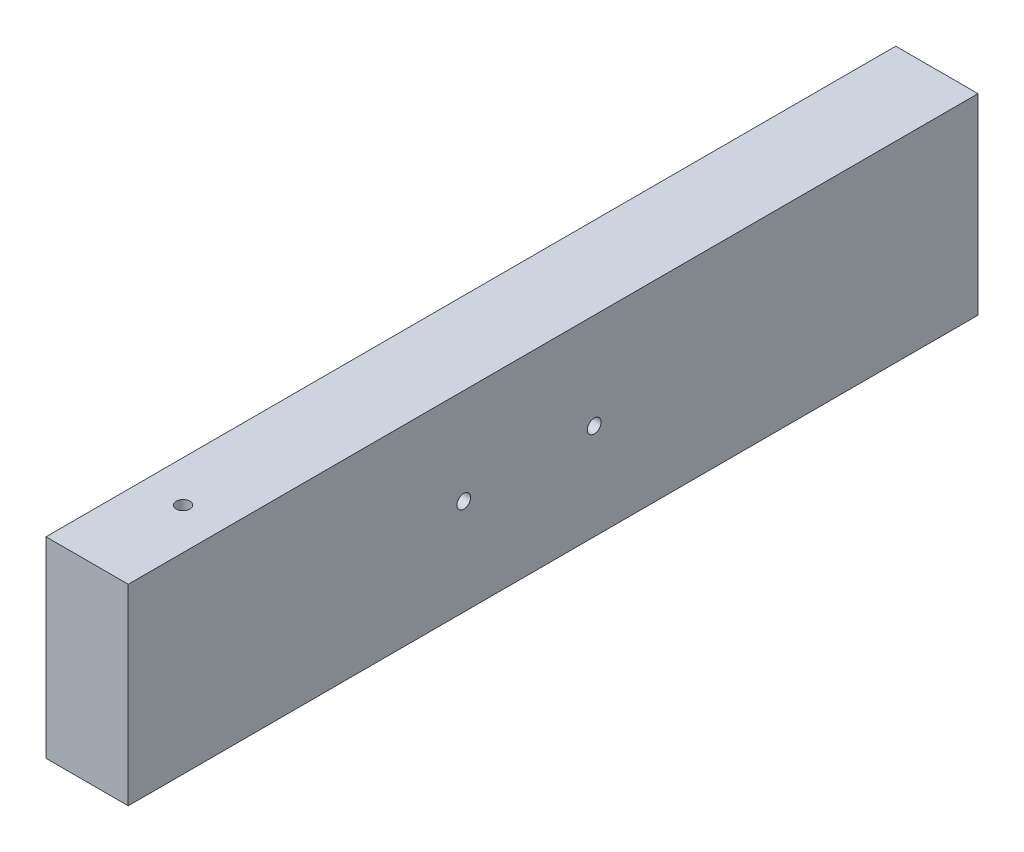
ISO-10303-21;
HEADER;
FILE_DESCRIPTION(('STEP AP214'),'2;1');
FILE_NAME('part.step','',(''),(''),'','','');
FILE_SCHEMA(('AUTOMOTIVE_DESIGN { 1 0 10303 214 1 1 1 1 }'));
ENDSEC;
DATA;
#1=APPLICATION_CONTEXT('core data for automotive mechanical design processes');
#2=APPLICATION_PROTOCOL_DEFINITION('international standard','automotive_design',2000,#1);
#3=PRODUCT_CONTEXT('',#1,'mechanical');
#4=PRODUCT('Part','Part','',(#3));
#5=PRODUCT_RELATED_PRODUCT_CATEGORY('part','',(#4));
#6=PRODUCT_DEFINITION_FORMATION('','',#4);
#7=PRODUCT_DEFINITION_CONTEXT('part definition',#1,'design');
#8=PRODUCT_DEFINITION('design','',#6,#7);
#9=PRODUCT_DEFINITION_SHAPE('','',#8);
#10=(LENGTH_UNIT() NAMED_UNIT(*) SI_UNIT(.MILLI.,.METRE.));
#11=(NAMED_UNIT(*) PLANE_ANGLE_UNIT() SI_UNIT($,.RADIAN.));
#12=(NAMED_UNIT(*) SI_UNIT($,.STERADIAN.) SOLID_ANGLE_UNIT());
#13=UNCERTAINTY_MEASURE_WITH_UNIT(LENGTH_MEASURE(1.E-05),#10,'distance_accuracy_value','');
#14=(GEOMETRIC_REPRESENTATION_CONTEXT(3) GLOBAL_UNCERTAINTY_ASSIGNED_CONTEXT((#13)) GLOBAL_UNIT_ASSIGNED_CONTEXT((#10,
#11,#12)) REPRESENTATION_CONTEXT('',''));
#15=CARTESIAN_POINT('',(0.,0.,0.));
#16=DIRECTION('',(0.,0.,1.));
#17=DIRECTION('',(1.,0.,0.));
#18=AXIS2_PLACEMENT_3D('',#15,#16,#17);
#19=CARTESIAN_POINT('',(-106.780263157895,88.9,70.9152960526316));
#20=DIRECTION('',(-1.,0.,0.));
#21=DIRECTION('',(0.,0.,1.));
#22=AXIS2_PLACEMENT_3D('',#19,#20,#21);
#23=PLANE('',#22);
#24=CARTESIAN_POINT('',(-106.780263157895,44.45,-84.5327039473683));
#25=DIRECTION('',(-1.,0.,0.));
#26=DIRECTION('',(0.,0.,1.));
#27=AXIS2_PLACEMENT_3D('',#24,#25,#26);
#28=CIRCLE('',#27,3.175);
#29=CARTESIAN_POINT('',(-106.780263157895,44.45,-81.3577039473683));
#30=VERTEX_POINT('',#29);
#31=EDGE_CURVE('E111',#30,#30,#28,.T.);
#32=ORIENTED_EDGE('',*,*,#31,.T.);
#33=EDGE_LOOP('',(#32));
#34=FACE_BOUND('',#33,.T.);
#35=CARTESIAN_POINT('',(-106.780263157895,44.45,-144.984703947368));
#36=DIRECTION('',(-1.,0.,0.));
#37=DIRECTION('',(0.,0.,1.));
#38=AXIS2_PLACEMENT_3D('',#35,#36,#37);
#39=CIRCLE('',#38,3.175);
#40=CARTESIAN_POINT('',(-106.780263157895,44.45,-141.809703947368));
#41=VERTEX_POINT('',#40);
#42=EDGE_CURVE('E132',#41,#41,#39,.T.);
#43=ORIENTED_EDGE('',*,*,#42,.T.);
#44=EDGE_LOOP('',(#43));
#45=FACE_BOUND('',#44,.T.);
#46=DIRECTION('',(0.,0.,-1.));
#47=VECTOR('',#46,1.);
#48=CARTESIAN_POINT('',(-106.780263157895,0.,70.9152960526316));
#49=LINE('',#48,#47);
#50=CARTESIAN_POINT('',(-106.780263157895,0.,70.9152960526316));
#51=VERTEX_POINT('',#50);
#52=CARTESIAN_POINT('',(-106.780263157895,0.,-322.784703947368));
#53=VERTEX_POINT('',#52);
#54=EDGE_CURVE('E107',#51,#53,#49,.T.);
#55=ORIENTED_EDGE('',*,*,#54,.T.);
#56=DIRECTION('',(0.,-1.,0.));
#57=VECTOR('',#56,1.);
#58=CARTESIAN_POINT('',(-106.780263157895,88.9,-322.784703947368));
#59=LINE('',#58,#57);
#60=CARTESIAN_POINT('',(-106.780263157895,88.9,-322.784703947368));
#61=VERTEX_POINT('',#60);
#62=EDGE_CURVE('E11',#61,#53,#59,.T.);
#63=ORIENTED_EDGE('',*,*,#62,.F.);
#64=DIRECTION('',(0.,0.,-1.));
#65=VECTOR('',#64,1.);
#66=CARTESIAN_POINT('',(-106.780263157895,88.9,70.9152960526316));
#67=LINE('',#66,#65);
#68=CARTESIAN_POINT('',(-106.780263157895,88.9,70.9152960526316));
#69=VERTEX_POINT('',#68);
#70=EDGE_CURVE('E91',#69,#61,#67,.T.);
#71=ORIENTED_EDGE('',*,*,#70,.F.);
#72=DIRECTION('',(0.,-1.,0.));
#73=VECTOR('',#72,1.);
#74=CARTESIAN_POINT('',(-106.780263157895,88.9,70.9152960526316));
#75=LINE('',#74,#73);
#76=EDGE_CURVE('E103',#69,#51,#75,.T.);
#77=ORIENTED_EDGE('',*,*,#76,.T.);
#78=EDGE_LOOP('',(#55,#63,#71,#77));
#79=FACE_BOUND('',#78,.T.);
#80=ADVANCED_FACE('F39',(#34,#45,#79),#23,.F.);
#81=CARTESIAN_POINT('',(-144.880263157895,88.9,-322.784703947368));
#82=DIRECTION('',(0.,0.,1.));
#83=DIRECTION('',(1.,0.,0.));
#84=AXIS2_PLACEMENT_3D('',#81,#82,#83);
#85=PLANE('',#84);
#86=DIRECTION('',(-1.,0.,0.));
#87=VECTOR('',#86,1.);
#88=CARTESIAN_POINT('',(-144.880263157895,0.,-322.784703947368));
#89=LINE('',#88,#87);
#90=CARTESIAN_POINT('',(-144.880263157895,0.,-322.784703947368));
#91=VERTEX_POINT('',#90);
#92=EDGE_CURVE('E96',#53,#91,#89,.T.);
#93=ORIENTED_EDGE('',*,*,#92,.T.);
#94=DIRECTION('',(0.,-1.,0.));
#95=VECTOR('',#94,1.);
#96=CARTESIAN_POINT('',(-144.880263157895,88.9,-322.784703947368));
#97=LINE('',#96,#95);
#98=CARTESIAN_POINT('',(-144.880263157895,88.9,-322.784703947368));
#99=VERTEX_POINT('',#98);
#100=EDGE_CURVE('E48',#99,#91,#97,.T.);
#101=ORIENTED_EDGE('',*,*,#100,.F.);
#102=DIRECTION('',(-1.,0.,0.));
#103=VECTOR('',#102,1.);
#104=CARTESIAN_POINT('',(-144.880263157895,88.9,-322.784703947368));
#105=LINE('',#104,#103);
#106=EDGE_CURVE('E86',#61,#99,#105,.T.);
#107=ORIENTED_EDGE('',*,*,#106,.F.);
#108=ORIENTED_EDGE('',*,*,#62,.T.);
#109=EDGE_LOOP('',(#93,#101,#107,#108));
#110=FACE_BOUND('',#109,.T.);
#111=ADVANCED_FACE('F95',(#110),#85,.F.);
#112=CARTESIAN_POINT('',(-144.880263157895,88.9,70.9152960526316));
#113=DIRECTION('',(1.,0.,0.));
#114=DIRECTION('',(0.,0.,-1.));
#115=AXIS2_PLACEMENT_3D('',#112,#113,#114);
#116=PLANE('',#115);
#117=CARTESIAN_POINT('',(-144.880263157895,44.45,-84.5327039473683));
#118=DIRECTION('',(-1.,0.,0.));
#119=DIRECTION('',(0.,0.,1.));
#120=AXIS2_PLACEMENT_3D('',#117,#118,#119);
#121=CIRCLE('',#120,3.175);
#122=CARTESIAN_POINT('',(-144.880263157895,44.45,-81.3577039473683));
#123=VERTEX_POINT('',#122);
#124=EDGE_CURVE('E137',#123,#123,#121,.T.);
#125=ORIENTED_EDGE('',*,*,#124,.F.);
#126=EDGE_LOOP('',(#125));
#127=FACE_BOUND('',#126,.T.);
#128=CARTESIAN_POINT('',(-144.880263157895,44.45,-144.984703947368));
#129=DIRECTION('',(-1.,0.,0.));
#130=DIRECTION('',(0.,0.,1.));
#131=AXIS2_PLACEMENT_3D('',#128,#129,#130);
#132=CIRCLE('',#131,3.175);
#133=CARTESIAN_POINT('',(-144.880263157895,44.45,-141.809703947368));
#134=VERTEX_POINT('',#133);
#135=EDGE_CURVE('E128',#134,#134,#132,.T.);
#136=ORIENTED_EDGE('',*,*,#135,.F.);
#137=EDGE_LOOP('',(#136));
#138=FACE_BOUND('',#137,.T.);
#139=DIRECTION('',(0.,0.,1.));
#140=VECTOR('',#139,1.);
#141=CARTESIAN_POINT('',(-144.880263157895,0.,70.9152960526316));
#142=LINE('',#141,#140);
#143=CARTESIAN_POINT('',(-144.880263157895,0.,70.9152960526316));
#144=VERTEX_POINT('',#143);
#145=EDGE_CURVE('E73',#91,#144,#142,.T.);
#146=ORIENTED_EDGE('',*,*,#145,.T.);
#147=DIRECTION('',(0.,-1.,0.));
#148=VECTOR('',#147,1.);
#149=CARTESIAN_POINT('',(-144.880263157895,88.9,70.9152960526316));
#150=LINE('',#149,#148);
#151=CARTESIAN_POINT('',(-144.880263157895,88.9,70.9152960526316));
#152=VERTEX_POINT('',#151);
#153=EDGE_CURVE('E98',#152,#144,#150,.T.);
#154=ORIENTED_EDGE('',*,*,#153,.F.);
#155=DIRECTION('',(0.,0.,1.));
#156=VECTOR('',#155,1.);
#157=CARTESIAN_POINT('',(-144.880263157895,88.9,70.9152960526316));
#158=LINE('',#157,#156);
#159=EDGE_CURVE('E89',#99,#152,#158,.T.);
#160=ORIENTED_EDGE('',*,*,#159,.F.);
#161=ORIENTED_EDGE('',*,*,#100,.T.);
#162=EDGE_LOOP('',(#146,#154,#160,#161));
#163=FACE_BOUND('',#162,.T.);
#164=ADVANCED_FACE('F99',(#127,#138,#163),#116,.F.);
#165=CARTESIAN_POINT('',(-144.880263157895,88.9,70.9152960526316));
#166=DIRECTION('',(0.,0.,-1.));
#167=DIRECTION('',(-1.,0.,0.));
#168=AXIS2_PLACEMENT_3D('',#165,#166,#167);
#169=PLANE('',#168);
#170=DIRECTION('',(1.,0.,0.));
#171=VECTOR('',#170,1.);
#172=CARTESIAN_POINT('',(-144.880263157895,0.,70.9152960526316));
#173=LINE('',#172,#171);
#174=EDGE_CURVE('E79',#144,#51,#173,.T.);
#175=ORIENTED_EDGE('',*,*,#174,.T.);
#176=ORIENTED_EDGE('',*,*,#76,.F.);
#177=DIRECTION('',(1.,0.,0.));
#178=VECTOR('',#177,1.);
#179=CARTESIAN_POINT('',(-144.880263157895,88.9,70.9152960526316));
#180=LINE('',#179,#178);
#181=EDGE_CURVE('E56',#152,#69,#180,.T.);
#182=ORIENTED_EDGE('',*,*,#181,.F.);
#183=ORIENTED_EDGE('',*,*,#153,.T.);
#184=EDGE_LOOP('',(#175,#176,#182,#183));
#185=FACE_BOUND('',#184,.T.);
#186=ADVANCED_FACE('F121',(#185),#169,.F.);
#187=CARTESIAN_POINT('',(0.,88.9,0.));
#188=DIRECTION('',(0.,-1.,0.));
#189=DIRECTION('',(0.,0.,-1.));
#190=AXIS2_PLACEMENT_3D('',#187,#188,#189);
#191=PLANE('',#190);
#192=CARTESIAN_POINT('',(-125.830263157895,88.9,26.4652960526316));
#193=DIRECTION('',(0.,-1.,0.));
#194=DIRECTION('',(0.,0.,-1.));
#195=AXIS2_PLACEMENT_3D('',#192,#193,#194);
#196=CIRCLE('',#195,3.175);
#197=CARTESIAN_POINT('',(-125.830263157895,88.9,23.2902960526316));
#198=VERTEX_POINT('',#197);
#199=EDGE_CURVE('E133',#198,#198,#196,.T.);
#200=ORIENTED_EDGE('',*,*,#199,.T.);
#201=EDGE_LOOP('',(#200));
#202=FACE_BOUND('',#201,.T.);
#203=ORIENTED_EDGE('',*,*,#70,.T.);
#204=ORIENTED_EDGE('',*,*,#106,.T.);
#205=ORIENTED_EDGE('',*,*,#159,.T.);
#206=ORIENTED_EDGE('',*,*,#181,.T.);
#207=EDGE_LOOP('',(#203,#204,#205,#206));
#208=FACE_BOUND('',#207,.T.);
#209=ADVANCED_FACE('F87',(#202,#208),#191,.F.);
#210=CARTESIAN_POINT('',(0.,0.,0.));
#211=DIRECTION('',(0.,-1.,0.));
#212=DIRECTION('',(0.,0.,-1.));
#213=AXIS2_PLACEMENT_3D('',#210,#211,#212);
#214=PLANE('',#213);
#215=CARTESIAN_POINT('',(-125.830263157895,0.,26.4652960526316));
#216=DIRECTION('',(0.,-1.,0.));
#217=DIRECTION('',(0.,0.,-1.));
#218=AXIS2_PLACEMENT_3D('',#215,#216,#217);
#219=CIRCLE('',#218,3.175);
#220=CARTESIAN_POINT('',(-125.830263157895,0.,23.2902960526316));
#221=VERTEX_POINT('',#220);
#222=EDGE_CURVE('E144',#221,#221,#219,.T.);
#223=ORIENTED_EDGE('',*,*,#222,.F.);
#224=EDGE_LOOP('',(#223));
#225=FACE_BOUND('',#224,.T.);
#226=ORIENTED_EDGE('',*,*,#54,.F.);
#227=ORIENTED_EDGE('',*,*,#174,.F.);
#228=ORIENTED_EDGE('',*,*,#145,.F.);
#229=ORIENTED_EDGE('',*,*,#92,.F.);
#230=EDGE_LOOP('',(#226,#227,#228,#229));
#231=FACE_BOUND('',#230,.T.);
#232=ADVANCED_FACE('F124',(#225,#231),#214,.T.);
#233=CARTESIAN_POINT('',(-106.780263157895,44.45,-144.984703947368));
#234=DIRECTION('',(-1.,0.,0.));
#235=DIRECTION('',(0.,0.,1.));
#236=AXIS2_PLACEMENT_3D('',#233,#234,#235);
#237=CYLINDRICAL_SURFACE('',#236,3.175);
#238=ORIENTED_EDGE('',*,*,#42,.F.);
#239=EDGE_LOOP('',(#238));
#240=FACE_BOUND('',#239,.T.);
#241=ORIENTED_EDGE('',*,*,#135,.T.);
#242=EDGE_LOOP('',(#241));
#243=FACE_BOUND('',#242,.T.);
#244=ADVANCED_FACE('F161',(#240,#243),#237,.F.);
#245=CARTESIAN_POINT('',(-106.780263157895,44.45,-84.5327039473683));
#246=DIRECTION('',(-1.,0.,0.));
#247=DIRECTION('',(0.,0.,1.));
#248=AXIS2_PLACEMENT_3D('',#245,#246,#247);
#249=CYLINDRICAL_SURFACE('',#248,3.175);
#250=ORIENTED_EDGE('',*,*,#31,.F.);
#251=EDGE_LOOP('',(#250));
#252=FACE_BOUND('',#251,.T.);
#253=ORIENTED_EDGE('',*,*,#124,.T.);
#254=EDGE_LOOP('',(#253));
#255=FACE_BOUND('',#254,.T.);
#256=ADVANCED_FACE('F156',(#252,#255),#249,.F.);
#257=CARTESIAN_POINT('',(-125.830263157895,88.9,26.4652960526316));
#258=DIRECTION('',(0.,-1.,0.));
#259=DIRECTION('',(0.,0.,-1.));
#260=AXIS2_PLACEMENT_3D('',#257,#258,#259);
#261=CYLINDRICAL_SURFACE('',#260,3.175);
#262=ORIENTED_EDGE('',*,*,#199,.F.);
#263=EDGE_LOOP('',(#262));
#264=FACE_BOUND('',#263,.T.);
#265=ORIENTED_EDGE('',*,*,#222,.T.);
#266=EDGE_LOOP('',(#265));
#267=FACE_BOUND('',#266,.T.);
#268=ADVANCED_FACE('F153',(#264,#267),#261,.F.);
#269=CLOSED_SHELL('',(#80,#111,#164,#186,#209,#232,#244,#256,#268));
#270=MANIFOLD_SOLID_BREP('B2',#269);
#271=ADVANCED_BREP_SHAPE_REPRESENTATION('',(#18,#270),#14);
#272=SHAPE_DEFINITION_REPRESENTATION(#9,#271);
ENDSEC;
END-ISO-10303-21;
